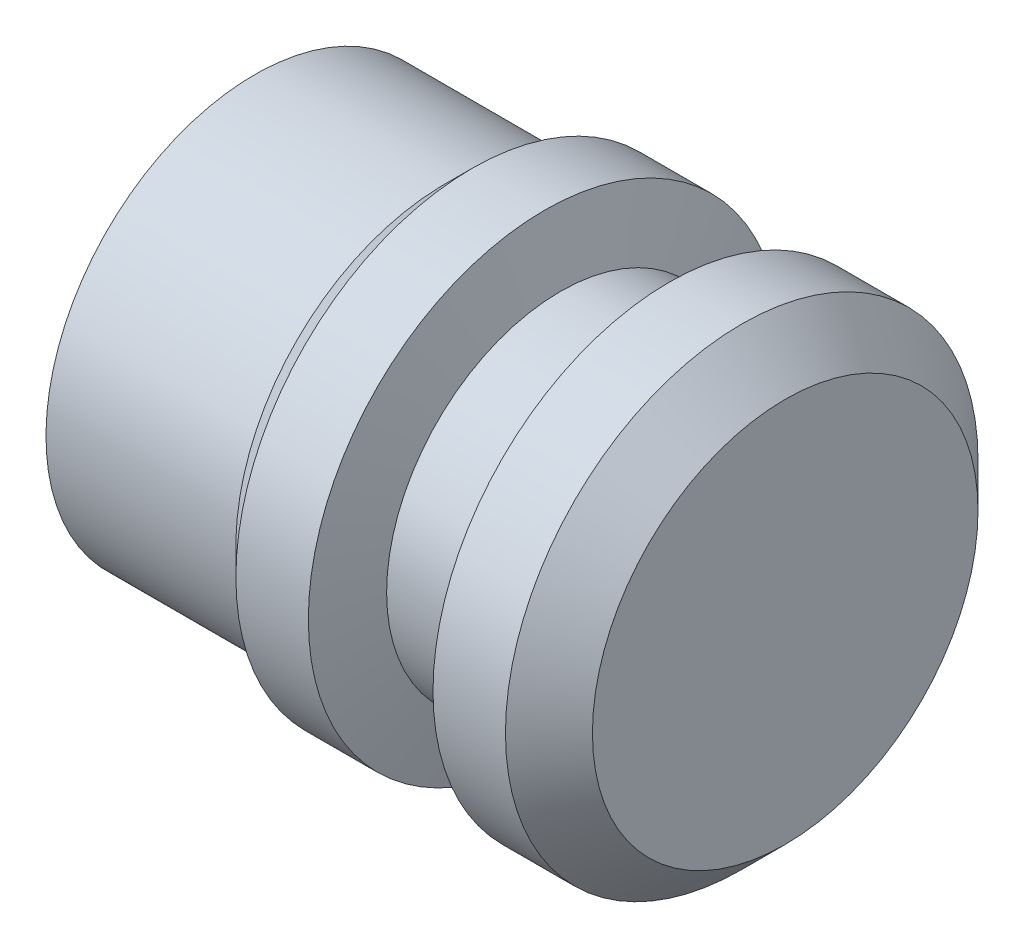
ISO-10303-21;
HEADER;
FILE_DESCRIPTION(('STEP AP214'),'2;1');
FILE_NAME('part.step','',(''),(''),'','','');
FILE_SCHEMA(('AUTOMOTIVE_DESIGN { 1 0 10303 214 1 1 1 1 }'));
ENDSEC;
DATA;
#1=APPLICATION_CONTEXT('core data for automotive mechanical design processes');
#2=APPLICATION_PROTOCOL_DEFINITION('international standard','automotive_design',2000,#1);
#3=PRODUCT_CONTEXT('',#1,'mechanical');
#4=PRODUCT('Part','Part','',(#3));
#5=PRODUCT_RELATED_PRODUCT_CATEGORY('part','',(#4));
#6=PRODUCT_DEFINITION_FORMATION('','',#4);
#7=PRODUCT_DEFINITION_CONTEXT('part definition',#1,'design');
#8=PRODUCT_DEFINITION('design','',#6,#7);
#9=PRODUCT_DEFINITION_SHAPE('','',#8);
#10=(LENGTH_UNIT() NAMED_UNIT(*) SI_UNIT(.MILLI.,.METRE.));
#11=(NAMED_UNIT(*) PLANE_ANGLE_UNIT() SI_UNIT($,.RADIAN.));
#12=(NAMED_UNIT(*) SI_UNIT($,.STERADIAN.) SOLID_ANGLE_UNIT());
#13=UNCERTAINTY_MEASURE_WITH_UNIT(LENGTH_MEASURE(1.E-05),#10,'distance_accuracy_value','');
#14=(GEOMETRIC_REPRESENTATION_CONTEXT(3) GLOBAL_UNCERTAINTY_ASSIGNED_CONTEXT((#13)) GLOBAL_UNIT_ASSIGNED_CONTEXT((#10,
#11,#12)) REPRESENTATION_CONTEXT('',''));
#15=CARTESIAN_POINT('',(0.,0.,0.));
#16=DIRECTION('',(0.,0.,1.));
#17=DIRECTION('',(1.,0.,0.));
#18=AXIS2_PLACEMENT_3D('',#15,#16,#17);
#19=CARTESIAN_POINT('',(-9.15,0.,0.));
#20=DIRECTION('',(-1.,0.,0.));
#21=DIRECTION('',(0.,0.,1.));
#22=AXIS2_PLACEMENT_3D('',#19,#20,#21);
#23=PLANE('',#22);
#24=CARTESIAN_POINT('',(-9.15,0.,0.));
#25=DIRECTION('',(-1.,0.,0.));
#26=DIRECTION('',(0.,0.,1.));
#27=AXIS2_PLACEMENT_3D('',#24,#25,#26);
#28=CIRCLE('',#27,0.55);
#29=CARTESIAN_POINT('',(-9.15,0.,0.55));
#30=VERTEX_POINT('',#29);
#31=EDGE_CURVE('E105',#30,#30,#28,.T.);
#32=ORIENTED_EDGE('',*,*,#31,.F.);
#33=EDGE_LOOP('',(#32));
#34=FACE_BOUND('',#33,.T.);
#35=CARTESIAN_POINT('',(-9.15,0.,0.));
#36=DIRECTION('',(-1.,0.,0.));
#37=DIRECTION('',(0.,0.,1.));
#38=AXIS2_PLACEMENT_3D('',#35,#36,#37);
#39=CIRCLE('',#38,2.05);
#40=CARTESIAN_POINT('',(-9.15,-0.907947530864197,-1.83796933630504));
#41=VERTEX_POINT('',#40);
#42=CARTESIAN_POINT('',(-9.15,-2.05,0.));
#43=VERTEX_POINT('',#42);
#44=EDGE_CURVE('E84',#41,#43,#39,.T.);
#45=ORIENTED_EDGE('',*,*,#44,.T.);
#46=DIRECTION('',(0.,-1.,0.));
#47=VECTOR('',#46,1.);
#48=CARTESIAN_POINT('',(-9.15,0.,0.));
#49=LINE('',#48,#47);
#50=CARTESIAN_POINT('',(-9.15,-3.6,0.));
#51=VERTEX_POINT('',#50);
#52=EDGE_CURVE('E75',#43,#51,#49,.T.);
#53=ORIENTED_EDGE('',*,*,#52,.T.);
#54=CARTESIAN_POINT('',(-9.15,0.,0.));
#55=DIRECTION('',(-1.,0.,0.));
#56=DIRECTION('',(0.,0.,1.));
#57=AXIS2_PLACEMENT_3D('',#54,#55,#56);
#58=CIRCLE('',#57,3.6);
#59=CARTESIAN_POINT('',(-9.15,-1.59444444444444,-3.22765346863325));
#60=VERTEX_POINT('',#59);
#61=EDGE_CURVE('E112',#51,#60,#58,.T.);
#62=ORIENTED_EDGE('',*,*,#61,.T.);
#63=DIRECTION('',(0.,-0.442901234567901,-0.89657040795368));
#64=VECTOR('',#63,1.);
#65=CARTESIAN_POINT('',(-9.15,0.,0.));
#66=LINE('',#65,#64);
#67=EDGE_CURVE('E100',#41,#60,#66,.T.);
#68=ORIENTED_EDGE('',*,*,#67,.F.);
#69=EDGE_LOOP('',(#45,#53,#62,#68));
#70=FACE_BOUND('',#69,.T.);
#71=ADVANCED_FACE('F35',(#34,#70),#23,.T.);
#72=CARTESIAN_POINT('',(-5.15,0.,0.));
#73=DIRECTION('',(-1.,0.,0.));
#74=DIRECTION('',(0.,0.,1.));
#75=AXIS2_PLACEMENT_3D('',#72,#73,#74);
#76=CYLINDRICAL_SURFACE('',#75,3.6);
#77=CARTESIAN_POINT('',(-5.875,0.,0.));
#78=DIRECTION('',(1.,0.,0.));
#79=DIRECTION('',(0.,0.,-1.));
#80=AXIS2_PLACEMENT_3D('',#77,#78,#79);
#81=CIRCLE('',#80,3.6);
#82=CARTESIAN_POINT('',(-5.875,0.,-3.6));
#83=VERTEX_POINT('',#82);
#84=EDGE_CURVE('E11',#83,#83,#81,.F.);
#85=ORIENTED_EDGE('',*,*,#84,.T.);
#86=EDGE_LOOP('',(#85));
#87=FACE_BOUND('',#86,.T.);
#88=ORIENTED_EDGE('',*,*,#61,.F.);
#89=DIRECTION('',(-1.,0.,0.));
#90=VECTOR('',#89,1.);
#91=CARTESIAN_POINT('',(-6.65,-3.6,0.));
#92=LINE('',#91,#90);
#93=CARTESIAN_POINT('',(-6.65,-3.6,0.));
#94=VERTEX_POINT('',#93);
#95=EDGE_CURVE('E106',#94,#51,#92,.T.);
#96=ORIENTED_EDGE('',*,*,#95,.F.);
#97=CARTESIAN_POINT('',(-6.65,0.,0.));
#98=DIRECTION('',(-1.,0.,0.));
#99=DIRECTION('',(0.,0.,1.));
#100=AXIS2_PLACEMENT_3D('',#97,#98,#99);
#101=CIRCLE('',#100,3.6);
#102=CARTESIAN_POINT('',(-6.65,-1.59444444444444,-3.22765346863325));
#103=VERTEX_POINT('',#102);
#104=EDGE_CURVE('E94',#103,#94,#101,.T.);
#105=ORIENTED_EDGE('',*,*,#104,.F.);
#106=DIRECTION('',(-1.,0.,0.));
#107=VECTOR('',#106,1.);
#108=CARTESIAN_POINT('',(-6.65,-1.59444444444444,-3.22765346863325));
#109=LINE('',#108,#107);
#110=EDGE_CURVE('E87',#103,#60,#109,.T.);
#111=ORIENTED_EDGE('',*,*,#110,.T.);
#112=EDGE_LOOP('',(#88,#96,#105,#111));
#113=FACE_BOUND('',#112,.T.);
#114=ADVANCED_FACE('F155',(#87,#113),#76,.T.);
#115=CARTESIAN_POINT('',(-23.0130090804004,0.,0.));
#116=DIRECTION('',(-1.,0.,0.));
#117=DIRECTION('',(0.,0.,1.));
#118=AXIS2_PLACEMENT_3D('',#115,#116,#117);
#119=CYLINDRICAL_SURFACE('',#118,4.075);
#120=CARTESIAN_POINT('',(-5.4,0.,0.));
#121=DIRECTION('',(1.,0.,0.));
#122=DIRECTION('',(0.,0.,-1.));
#123=AXIS2_PLACEMENT_3D('',#120,#121,#122);
#124=CIRCLE('',#123,4.075);
#125=CARTESIAN_POINT('',(-5.4,0.,-4.075));
#126=VERTEX_POINT('',#125);
#127=EDGE_CURVE('E43',#126,#126,#124,.T.);
#128=ORIENTED_EDGE('',*,*,#127,.T.);
#129=EDGE_LOOP('',(#128));
#130=FACE_BOUND('',#129,.T.);
#131=CARTESIAN_POINT('',(-4.15,0.,0.));
#132=DIRECTION('',(-1.,0.,0.));
#133=DIRECTION('',(0.,0.,1.));
#134=AXIS2_PLACEMENT_3D('',#131,#132,#133);
#135=CIRCLE('',#134,4.075);
#136=CARTESIAN_POINT('',(-4.15,0.,4.075));
#137=VERTEX_POINT('',#136);
#138=EDGE_CURVE('E117',#137,#137,#135,.T.);
#139=ORIENTED_EDGE('',*,*,#138,.T.);
#140=EDGE_LOOP('',(#139));
#141=FACE_BOUND('',#140,.T.);
#142=ADVANCED_FACE('F137',(#130,#141),#119,.T.);
#143=CARTESIAN_POINT('',(0.,0.,0.));
#144=DIRECTION('',(-1.,0.,0.));
#145=DIRECTION('',(0.,0.,1.));
#146=AXIS2_PLACEMENT_3D('',#143,#144,#145);
#147=PLANE('',#146);
#148=CARTESIAN_POINT('',(0.,0.,0.));
#149=DIRECTION('',(-1.,0.,0.));
#150=DIRECTION('',(0.,0.,1.));
#151=AXIS2_PLACEMENT_3D('',#148,#149,#150);
#152=CIRCLE('',#151,3.32499999999999);
#153=CARTESIAN_POINT('',(0.,0.,3.32499999999999));
#154=VERTEX_POINT('',#153);
#155=EDGE_CURVE('E132',#154,#154,#152,.F.);
#156=ORIENTED_EDGE('',*,*,#155,.T.);
#157=EDGE_LOOP('',(#156));
#158=FACE_BOUND('',#157,.T.);
#159=ADVANCED_FACE('F181',(#158),#147,.F.);
#160=CARTESIAN_POINT('',(-23.0130090804004,0.,0.));
#161=DIRECTION('',(-1.,0.,0.));
#162=DIRECTION('',(0.,0.,1.));
#163=AXIS2_PLACEMENT_3D('',#160,#161,#162);
#164=CYLINDRICAL_SURFACE('',#163,4.075);
#165=CARTESIAN_POINT('',(-0.750000000000004,0.,0.));
#166=DIRECTION('',(-1.,0.,0.));
#167=DIRECTION('',(0.,0.,1.));
#168=AXIS2_PLACEMENT_3D('',#165,#166,#167);
#169=CIRCLE('',#168,4.075);
#170=CARTESIAN_POINT('',(-0.750000000000004,0.,4.075));
#171=VERTEX_POINT('',#170);
#172=EDGE_CURVE('E129',#171,#171,#169,.T.);
#173=ORIENTED_EDGE('',*,*,#172,.T.);
#174=EDGE_LOOP('',(#173));
#175=FACE_BOUND('',#174,.T.);
#176=CARTESIAN_POINT('',(-2.,0.,0.));
#177=DIRECTION('',(-1.,0.,0.));
#178=DIRECTION('',(0.,0.,1.));
#179=AXIS2_PLACEMENT_3D('',#176,#177,#178);
#180=CIRCLE('',#179,4.075);
#181=CARTESIAN_POINT('',(-2.,0.,4.075));
#182=VERTEX_POINT('',#181);
#183=EDGE_CURVE('E126',#182,#182,#180,.T.);
#184=ORIENTED_EDGE('',*,*,#183,.F.);
#185=EDGE_LOOP('',(#184));
#186=FACE_BOUND('',#185,.T.);
#187=ADVANCED_FACE('F177',(#175,#186),#164,.T.);
#188=CARTESIAN_POINT('',(-2.,0.,0.));
#189=DIRECTION('',(1.,0.,0.));
#190=DIRECTION('',(0.,0.,-1.));
#191=AXIS2_PLACEMENT_3D('',#188,#189,#190);
#192=CONICAL_SURFACE('',#191,4.075,1.32035323718355);
#193=CARTESIAN_POINT('',(-2.275,0.,0.));
#194=DIRECTION('',(-1.,0.,0.));
#195=DIRECTION('',(0.,0.,1.));
#196=AXIS2_PLACEMENT_3D('',#193,#194,#195);
#197=CIRCLE('',#196,3.);
#198=CARTESIAN_POINT('',(-2.275,0.,3.));
#199=VERTEX_POINT('',#198);
#200=EDGE_CURVE('E123',#199,#199,#197,.T.);
#201=ORIENTED_EDGE('',*,*,#200,.F.);
#202=EDGE_LOOP('',(#201));
#203=FACE_BOUND('',#202,.T.);
#204=ORIENTED_EDGE('',*,*,#183,.T.);
#205=EDGE_LOOP('',(#204));
#206=FACE_BOUND('',#205,.T.);
#207=ADVANCED_FACE('F173',(#203,#206),#192,.T.);
#208=CARTESIAN_POINT('',(-23.0130090804004,0.,0.));
#209=DIRECTION('',(-1.,0.,0.));
#210=DIRECTION('',(0.,0.,1.));
#211=AXIS2_PLACEMENT_3D('',#208,#209,#210);
#212=CYLINDRICAL_SURFACE('',#211,3.);
#213=CARTESIAN_POINT('',(-3.875,0.,0.));
#214=DIRECTION('',(-1.,0.,0.));
#215=DIRECTION('',(0.,0.,1.));
#216=AXIS2_PLACEMENT_3D('',#213,#214,#215);
#217=CIRCLE('',#216,3.);
#218=CARTESIAN_POINT('',(-3.875,0.,3.));
#219=VERTEX_POINT('',#218);
#220=EDGE_CURVE('E120',#219,#219,#217,.T.);
#221=ORIENTED_EDGE('',*,*,#220,.F.);
#222=EDGE_LOOP('',(#221));
#223=FACE_BOUND('',#222,.T.);
#224=ORIENTED_EDGE('',*,*,#200,.T.);
#225=EDGE_LOOP('',(#224));
#226=FACE_BOUND('',#225,.T.);
#227=ADVANCED_FACE('F169',(#223,#226),#212,.T.);
#228=CARTESIAN_POINT('',(-3.875,0.,0.));
#229=DIRECTION('',(-1.,0.,0.));
#230=DIRECTION('',(0.,0.,1.));
#231=AXIS2_PLACEMENT_3D('',#228,#229,#230);
#232=CONICAL_SURFACE('',#231,3.,1.32035323718354);
#233=ORIENTED_EDGE('',*,*,#138,.F.);
#234=EDGE_LOOP('',(#233));
#235=FACE_BOUND('',#234,.T.);
#236=ORIENTED_EDGE('',*,*,#220,.T.);
#237=EDGE_LOOP('',(#236));
#238=FACE_BOUND('',#237,.T.);
#239=ADVANCED_FACE('F151',(#235,#238),#232,.T.);
#240=CARTESIAN_POINT('',(-0.750000000000004,0.,0.));
#241=DIRECTION('',(-1.,0.,0.));
#242=DIRECTION('',(0.,0.,1.));
#243=AXIS2_PLACEMENT_3D('',#240,#241,#242);
#244=CONICAL_SURFACE('',#243,4.075,0.785398163397451);
#245=ORIENTED_EDGE('',*,*,#155,.F.);
#246=EDGE_LOOP('',(#245));
#247=FACE_BOUND('',#246,.T.);
#248=ORIENTED_EDGE('',*,*,#172,.F.);
#249=EDGE_LOOP('',(#248));
#250=FACE_BOUND('',#249,.T.);
#251=ADVANCED_FACE('F142',(#247,#250),#244,.T.);
#252=CARTESIAN_POINT('',(-6.15,0.,0.));
#253=DIRECTION('',(1.,0.,0.));
#254=DIRECTION('',(0.,0.,-1.));
#255=AXIS2_PLACEMENT_3D('',#252,#253,#254);
#256=CONICAL_SURFACE('',#255,3.325,0.785398163397447);
#257=ORIENTED_EDGE('',*,*,#84,.F.);
#258=EDGE_LOOP('',(#257));
#259=FACE_BOUND('',#258,.T.);
#260=ORIENTED_EDGE('',*,*,#127,.F.);
#261=EDGE_LOOP('',(#260));
#262=FACE_BOUND('',#261,.T.);
#263=ADVANCED_FACE('F37',(#259,#262),#256,.T.);
#264=CARTESIAN_POINT('',(-11.15,0.,0.));
#265=DIRECTION('',(1.,0.,0.));
#266=DIRECTION('',(0.,0.,-1.));
#267=AXIS2_PLACEMENT_3D('',#264,#265,#266);
#268=CYLINDRICAL_SURFACE('',#267,0.55);
#269=CARTESIAN_POINT('',(-11.15,0.,0.));
#270=DIRECTION('',(-1.,0.,0.));
#271=DIRECTION('',(0.,0.,1.));
#272=AXIS2_PLACEMENT_3D('',#269,#270,#271);
#273=CIRCLE('',#272,0.55);
#274=CARTESIAN_POINT('',(-11.15,0.,0.55));
#275=VERTEX_POINT('',#274);
#276=EDGE_CURVE('E109',#275,#275,#273,.T.);
#277=ORIENTED_EDGE('',*,*,#276,.F.);
#278=EDGE_LOOP('',(#277));
#279=FACE_BOUND('',#278,.T.);
#280=ORIENTED_EDGE('',*,*,#31,.T.);
#281=EDGE_LOOP('',(#280));
#282=FACE_BOUND('',#281,.T.);
#283=ADVANCED_FACE('F141',(#279,#282),#268,.T.);
#284=CARTESIAN_POINT('',(-11.15,0.,0.));
#285=DIRECTION('',(-1.,0.,0.));
#286=DIRECTION('',(0.,0.,1.));
#287=AXIS2_PLACEMENT_3D('',#284,#285,#286);
#288=PLANE('',#287);
#289=ORIENTED_EDGE('',*,*,#276,.T.);
#290=EDGE_LOOP('',(#289));
#291=FACE_BOUND('',#290,.T.);
#292=ADVANCED_FACE('F148',(#291),#288,.T.);
#293=CARTESIAN_POINT('',(-6.65,0.,0.));
#294=DIRECTION('',(-1.,0.,0.));
#295=DIRECTION('',(0.,0.,1.));
#296=AXIS2_PLACEMENT_3D('',#293,#294,#295);
#297=CYLINDRICAL_SURFACE('',#296,2.05);
#298=ORIENTED_EDGE('',*,*,#44,.F.);
#299=DIRECTION('',(-1.,0.,0.));
#300=VECTOR('',#299,1.);
#301=CARTESIAN_POINT('',(-6.65,-0.907947530864197,-1.83796933630504));
#302=LINE('',#301,#300);
#303=CARTESIAN_POINT('',(-6.65,-0.907947530864197,-1.83796933630504));
#304=VERTEX_POINT('',#303);
#305=EDGE_CURVE('E80',#304,#41,#302,.T.);
#306=ORIENTED_EDGE('',*,*,#305,.F.);
#307=CARTESIAN_POINT('',(-6.65,0.,0.));
#308=DIRECTION('',(-1.,0.,0.));
#309=DIRECTION('',(0.,0.,1.));
#310=AXIS2_PLACEMENT_3D('',#307,#308,#309);
#311=CIRCLE('',#310,2.05);
#312=CARTESIAN_POINT('',(-6.65,-2.05,0.));
#313=VERTEX_POINT('',#312);
#314=EDGE_CURVE('E82',#304,#313,#311,.T.);
#315=ORIENTED_EDGE('',*,*,#314,.T.);
#316=DIRECTION('',(-1.,0.,0.));
#317=VECTOR('',#316,1.);
#318=CARTESIAN_POINT('',(-6.65,-2.05,0.));
#319=LINE('',#318,#317);
#320=EDGE_CURVE('E103',#313,#43,#319,.T.);
#321=ORIENTED_EDGE('',*,*,#320,.T.);
#322=EDGE_LOOP('',(#298,#306,#315,#321));
#323=FACE_BOUND('',#322,.T.);
#324=ADVANCED_FACE('F81',(#323),#297,.T.);
#325=CARTESIAN_POINT('',(-6.65,0.,0.));
#326=DIRECTION('',(0.,0.,-1.));
#327=DIRECTION('',(-1.,0.,0.));
#328=AXIS2_PLACEMENT_3D('',#325,#326,#327);
#329=PLANE('',#328);
#330=ORIENTED_EDGE('',*,*,#52,.F.);
#331=ORIENTED_EDGE('',*,*,#320,.F.);
#332=DIRECTION('',(0.,-1.,0.));
#333=VECTOR('',#332,1.);
#334=CARTESIAN_POINT('',(-6.65,0.,0.));
#335=LINE('',#334,#333);
#336=EDGE_CURVE('E56',#313,#94,#335,.T.);
#337=ORIENTED_EDGE('',*,*,#336,.T.);
#338=ORIENTED_EDGE('',*,*,#95,.T.);
#339=EDGE_LOOP('',(#330,#331,#337,#338));
#340=FACE_BOUND('',#339,.T.);
#341=ADVANCED_FACE('F250',(#340),#329,.T.);
#342=CARTESIAN_POINT('',(-6.65,0.,0.));
#343=DIRECTION('',(0.,0.896570407953681,-0.442901234567901));
#344=DIRECTION('',(0.,0.442901234567901,0.896570407953681));
#345=AXIS2_PLACEMENT_3D('',#342,#343,#344);
#346=PLANE('',#345);
#347=ORIENTED_EDGE('',*,*,#67,.T.);
#348=ORIENTED_EDGE('',*,*,#110,.F.);
#349=DIRECTION('',(0.,-0.442901234567901,-0.89657040795368));
#350=VECTOR('',#349,1.);
#351=CARTESIAN_POINT('',(-6.65,0.,0.));
#352=LINE('',#351,#350);
#353=EDGE_CURVE('E50',#304,#103,#352,.T.);
#354=ORIENTED_EDGE('',*,*,#353,.F.);
#355=ORIENTED_EDGE('',*,*,#305,.T.);
#356=EDGE_LOOP('',(#347,#348,#354,#355));
#357=FACE_BOUND('',#356,.T.);
#358=ADVANCED_FACE('F91',(#357),#346,.F.);
#359=CARTESIAN_POINT('',(-6.65,0.,0.));
#360=DIRECTION('',(-1.,0.,0.));
#361=DIRECTION('',(0.,0.,1.));
#362=AXIS2_PLACEMENT_3D('',#359,#360,#361);
#363=PLANE('',#362);
#364=ORIENTED_EDGE('',*,*,#314,.F.);
#365=ORIENTED_EDGE('',*,*,#353,.T.);
#366=ORIENTED_EDGE('',*,*,#104,.T.);
#367=ORIENTED_EDGE('',*,*,#336,.F.);
#368=EDGE_LOOP('',(#364,#365,#366,#367));
#369=FACE_BOUND('',#368,.T.);
#370=ADVANCED_FACE('F89',(#369),#363,.T.);
#371=CLOSED_SHELL('',(#71,#114,#142,#159,#187,#207,#227,#239,#251,#263,#283,#292,#324,#341,#358,#370));
#372=MANIFOLD_SOLID_BREP('B2',#371);
#373=ADVANCED_BREP_SHAPE_REPRESENTATION('',(#18,#372),#14);
#374=SHAPE_DEFINITION_REPRESENTATION(#9,#373);
ENDSEC;
END-ISO-10303-21;
